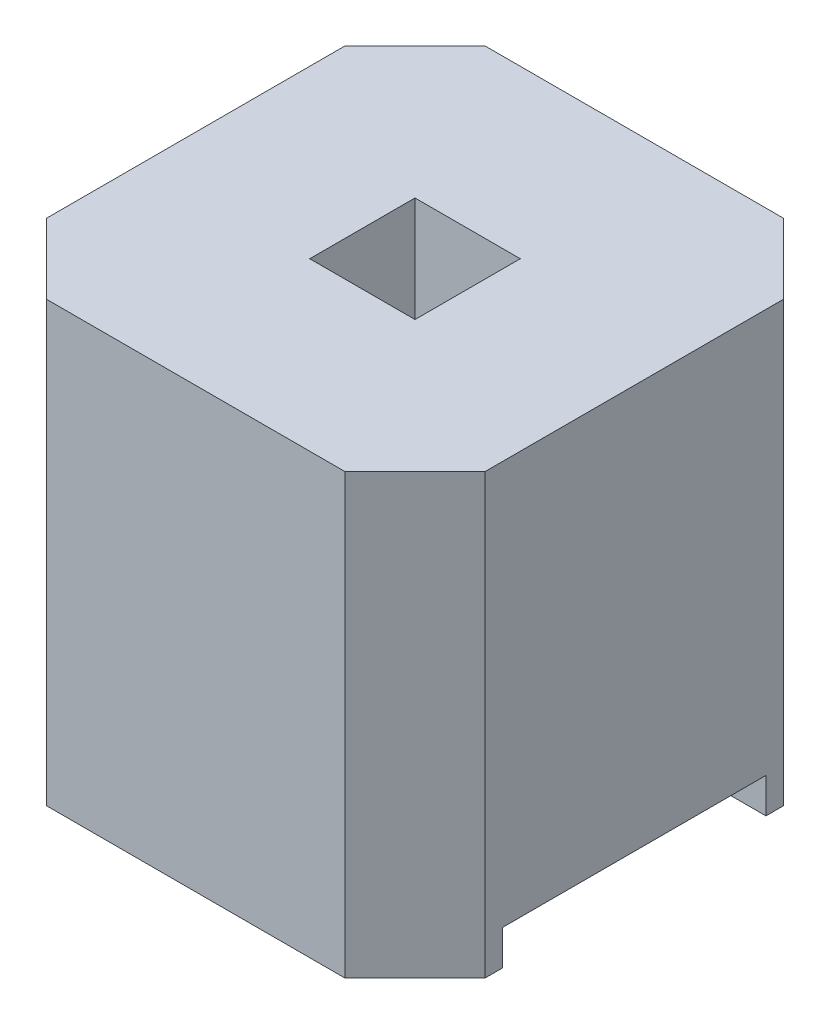
ISO-10303-21;
HEADER;
FILE_DESCRIPTION(('STEP AP214'),'2;1');
FILE_NAME('part.step','',(''),(''),'','','');
FILE_SCHEMA(('AUTOMOTIVE_DESIGN { 1 0 10303 214 1 1 1 1 }'));
ENDSEC;
DATA;
#1=APPLICATION_CONTEXT('core data for automotive mechanical design processes');
#2=APPLICATION_PROTOCOL_DEFINITION('international standard','automotive_design',2000,#1);
#3=PRODUCT_CONTEXT('',#1,'mechanical');
#4=PRODUCT('Part','Part','',(#3));
#5=PRODUCT_RELATED_PRODUCT_CATEGORY('part','',(#4));
#6=PRODUCT_DEFINITION_FORMATION('','',#4);
#7=PRODUCT_DEFINITION_CONTEXT('part definition',#1,'design');
#8=PRODUCT_DEFINITION('design','',#6,#7);
#9=PRODUCT_DEFINITION_SHAPE('','',#8);
#10=(LENGTH_UNIT() NAMED_UNIT(*) SI_UNIT(.MILLI.,.METRE.));
#11=(NAMED_UNIT(*) PLANE_ANGLE_UNIT() SI_UNIT($,.RADIAN.));
#12=(NAMED_UNIT(*) SI_UNIT($,.STERADIAN.) SOLID_ANGLE_UNIT());
#13=UNCERTAINTY_MEASURE_WITH_UNIT(LENGTH_MEASURE(1.E-05),#10,'distance_accuracy_value','');
#14=(GEOMETRIC_REPRESENTATION_CONTEXT(3) GLOBAL_UNCERTAINTY_ASSIGNED_CONTEXT((#13)) GLOBAL_UNIT_ASSIGNED_CONTEXT((#10,
#11,#12)) REPRESENTATION_CONTEXT('',''));
#15=CARTESIAN_POINT('',(0.,0.,0.));
#16=DIRECTION('',(0.,0.,1.));
#17=DIRECTION('',(1.,0.,0.));
#18=AXIS2_PLACEMENT_3D('',#15,#16,#17);
#19=CARTESIAN_POINT('',(0.,0.,0.));
#20=DIRECTION('',(0.,-1.,0.));
#21=DIRECTION('',(0.,0.,-1.));
#22=AXIS2_PLACEMENT_3D('',#19,#20,#21);
#23=PLANE('',#22);
#24=DIRECTION('',(-1.,0.,0.));
#25=VECTOR('',#24,1.);
#26=CARTESIAN_POINT('',(0.,0.,0.75));
#27=LINE('',#26,#25);
#28=CARTESIAN_POINT('',(1.25,0.,0.75));
#29=VERTEX_POINT('',#28);
#30=CARTESIAN_POINT('',(-1.25,0.,0.75));
#31=VERTEX_POINT('',#30);
#32=EDGE_CURVE('E284',#29,#31,#27,.T.);
#33=ORIENTED_EDGE('',*,*,#32,.F.);
#34=DIRECTION('',(0.,0.,-1.));
#35=VECTOR('',#34,1.);
#36=CARTESIAN_POINT('',(1.25,0.,0.850000000000001));
#37=LINE('',#36,#35);
#38=CARTESIAN_POINT('',(1.25,0.,0.850000000000001));
#39=VERTEX_POINT('',#38);
#40=EDGE_CURVE('E166',#39,#29,#37,.T.);
#41=ORIENTED_EDGE('',*,*,#40,.F.);
#42=DIRECTION('',(0.707106781186547,0.,-0.707106781186548));
#43=VECTOR('',#42,1.);
#44=CARTESIAN_POINT('',(0.850000000000001,0.,1.25));
#45=LINE('',#44,#43);
#46=CARTESIAN_POINT('',(0.850000000000001,0.,1.25));
#47=VERTEX_POINT('',#46);
#48=EDGE_CURVE('E177',#47,#39,#45,.T.);
#49=ORIENTED_EDGE('',*,*,#48,.F.);
#50=DIRECTION('',(1.,0.,0.));
#51=VECTOR('',#50,1.);
#52=CARTESIAN_POINT('',(-0.85,0.,1.25));
#53=LINE('',#52,#51);
#54=CARTESIAN_POINT('',(-0.85,0.,1.25));
#55=VERTEX_POINT('',#54);
#56=EDGE_CURVE('E258',#55,#47,#53,.T.);
#57=ORIENTED_EDGE('',*,*,#56,.F.);
#58=DIRECTION('',(0.707106781186547,0.,0.707106781186547));
#59=VECTOR('',#58,1.);
#60=CARTESIAN_POINT('',(-1.25,0.,0.850000000000001));
#61=LINE('',#60,#59);
#62=CARTESIAN_POINT('',(-1.25,0.,0.850000000000001));
#63=VERTEX_POINT('',#62);
#64=EDGE_CURVE('E257',#63,#55,#61,.T.);
#65=ORIENTED_EDGE('',*,*,#64,.F.);
#66=DIRECTION('',(0.,0.,1.));
#67=VECTOR('',#66,1.);
#68=CARTESIAN_POINT('',(-1.25,0.,0.850000000000001));
#69=LINE('',#68,#67);
#70=EDGE_CURVE('E238',#31,#63,#69,.T.);
#71=ORIENTED_EDGE('',*,*,#70,.F.);
#72=EDGE_LOOP('',(#33,#41,#49,#57,#65,#71));
#73=FACE_BOUND('',#72,.T.);
#74=ADVANCED_FACE('F33',(#73),#23,.T.);
#75=CARTESIAN_POINT('',(0.,2.5,0.));
#76=DIRECTION('',(0.,-1.,0.));
#77=DIRECTION('',(0.,0.,-1.));
#78=AXIS2_PLACEMENT_3D('',#75,#76,#77);
#79=PLANE('',#78);
#80=DIRECTION('',(0.,0.,1.));
#81=VECTOR('',#80,1.);
#82=CARTESIAN_POINT('',(-1.25,2.5,0.850000000000001));
#83=LINE('',#82,#81);
#84=CARTESIAN_POINT('',(-1.25,2.5,-0.849999999999999));
#85=VERTEX_POINT('',#84);
#86=CARTESIAN_POINT('',(-1.25,2.5,0.850000000000001));
#87=VERTEX_POINT('',#86);
#88=EDGE_CURVE('E184',#85,#87,#83,.T.);
#89=ORIENTED_EDGE('',*,*,#88,.T.);
#90=DIRECTION('',(0.707106781186547,0.,0.707106781186547));
#91=VECTOR('',#90,1.);
#92=CARTESIAN_POINT('',(-1.25,2.5,0.850000000000001));
#93=LINE('',#92,#91);
#94=CARTESIAN_POINT('',(-0.85,2.5,1.25));
#95=VERTEX_POINT('',#94);
#96=EDGE_CURVE('E241',#87,#95,#93,.T.);
#97=ORIENTED_EDGE('',*,*,#96,.T.);
#98=DIRECTION('',(1.,0.,0.));
#99=VECTOR('',#98,1.);
#100=CARTESIAN_POINT('',(-0.85,2.5,1.25));
#101=LINE('',#100,#99);
#102=CARTESIAN_POINT('',(0.850000000000001,2.5,1.25));
#103=VERTEX_POINT('',#102);
#104=EDGE_CURVE('E243',#95,#103,#101,.T.);
#105=ORIENTED_EDGE('',*,*,#104,.T.);
#106=DIRECTION('',(0.707106781186547,0.,-0.707106781186548));
#107=VECTOR('',#106,1.);
#108=CARTESIAN_POINT('',(0.850000000000001,2.5,1.25));
#109=LINE('',#108,#107);
#110=CARTESIAN_POINT('',(1.25,2.5,0.850000000000001));
#111=VERTEX_POINT('',#110);
#112=EDGE_CURVE('E245',#103,#111,#109,.T.);
#113=ORIENTED_EDGE('',*,*,#112,.T.);
#114=DIRECTION('',(0.,0.,-1.));
#115=VECTOR('',#114,1.);
#116=CARTESIAN_POINT('',(1.25,2.5,0.850000000000001));
#117=LINE('',#116,#115);
#118=CARTESIAN_POINT('',(1.25,2.5,-0.849999999999999));
#119=VERTEX_POINT('',#118);
#120=EDGE_CURVE('E247',#111,#119,#117,.T.);
#121=ORIENTED_EDGE('',*,*,#120,.T.);
#122=DIRECTION('',(-0.707106781186547,0.,-0.707106781186547));
#123=VECTOR('',#122,1.);
#124=CARTESIAN_POINT('',(0.85,2.5,-1.25));
#125=LINE('',#124,#123);
#126=CARTESIAN_POINT('',(0.85,2.5,-1.25));
#127=VERTEX_POINT('',#126);
#128=EDGE_CURVE('E249',#119,#127,#125,.T.);
#129=ORIENTED_EDGE('',*,*,#128,.T.);
#130=DIRECTION('',(-1.,0.,0.));
#131=VECTOR('',#130,1.);
#132=CARTESIAN_POINT('',(-0.85,2.5,-1.25));
#133=LINE('',#132,#131);
#134=CARTESIAN_POINT('',(-0.85,2.5,-1.25));
#135=VERTEX_POINT('',#134);
#136=EDGE_CURVE('E251',#127,#135,#133,.T.);
#137=ORIENTED_EDGE('',*,*,#136,.T.);
#138=DIRECTION('',(-0.707106781186547,0.,0.707106781186547));
#139=VECTOR('',#138,1.);
#140=CARTESIAN_POINT('',(-1.25,2.5,-0.849999999999999));
#141=LINE('',#140,#139);
#142=EDGE_CURVE('E189',#135,#85,#141,.T.);
#143=ORIENTED_EDGE('',*,*,#142,.T.);
#144=EDGE_LOOP('',(#89,#97,#105,#113,#121,#129,#137,#143));
#145=FACE_BOUND('',#144,.T.);
#146=DIRECTION('',(0.,0.,1.));
#147=VECTOR('',#146,1.);
#148=CARTESIAN_POINT('',(-0.3,2.5,-0.299999999999999));
#149=LINE('',#148,#147);
#150=CARTESIAN_POINT('',(-0.3,2.5,-0.299999999999999));
#151=VERTEX_POINT('',#150);
#152=CARTESIAN_POINT('',(-0.3,2.5,0.3));
#153=VERTEX_POINT('',#152);
#154=EDGE_CURVE('E286',#151,#153,#149,.T.);
#155=ORIENTED_EDGE('',*,*,#154,.F.);
#156=DIRECTION('',(-1.,0.,0.));
#157=VECTOR('',#156,1.);
#158=CARTESIAN_POINT('',(0.3,2.5,-0.3));
#159=LINE('',#158,#157);
#160=CARTESIAN_POINT('',(0.3,2.5,-0.3));
#161=VERTEX_POINT('',#160);
#162=EDGE_CURVE('E226',#161,#151,#159,.T.);
#163=ORIENTED_EDGE('',*,*,#162,.F.);
#164=DIRECTION('',(0.,0.,-1.));
#165=VECTOR('',#164,1.);
#166=CARTESIAN_POINT('',(0.3,2.5,-0.3));
#167=LINE('',#166,#165);
#168=CARTESIAN_POINT('',(0.3,2.5,0.3));
#169=VERTEX_POINT('',#168);
#170=EDGE_CURVE('E231',#169,#161,#167,.T.);
#171=ORIENTED_EDGE('',*,*,#170,.F.);
#172=DIRECTION('',(1.,0.,0.));
#173=VECTOR('',#172,1.);
#174=CARTESIAN_POINT('',(0.3,2.5,0.3));
#175=LINE('',#174,#173);
#176=EDGE_CURVE('E288',#153,#169,#175,.T.);
#177=ORIENTED_EDGE('',*,*,#176,.F.);
#178=EDGE_LOOP('',(#155,#163,#171,#177));
#179=FACE_BOUND('',#178,.T.);
#180=ADVANCED_FACE('F296',(#145,#179),#79,.F.);
#181=DIRECTION('',(1.,0.,0.));
#182=VECTOR('',#181,1.);
#183=CARTESIAN_POINT('',(0.,0.,-0.75));
#184=LINE('',#183,#182);
#185=CARTESIAN_POINT('',(-1.25,0.,-0.75));
#186=VERTEX_POINT('',#185);
#187=CARTESIAN_POINT('',(1.25,0.,-0.75));
#188=VERTEX_POINT('',#187);
#189=EDGE_CURVE('E221',#186,#188,#184,.T.);
#190=ORIENTED_EDGE('',*,*,#189,.F.);
#191=CARTESIAN_POINT('',(-1.25,0.,-0.849999999999999));
#192=VERTEX_POINT('',#191);
#193=EDGE_CURVE('E254',#192,#186,#69,.T.);
#194=ORIENTED_EDGE('',*,*,#193,.F.);
#195=DIRECTION('',(-0.707106781186547,0.,0.707106781186547));
#196=VECTOR('',#195,1.);
#197=CARTESIAN_POINT('',(-1.25,0.,-0.849999999999999));
#198=LINE('',#197,#196);
#199=CARTESIAN_POINT('',(-0.85,0.,-1.25));
#200=VERTEX_POINT('',#199);
#201=EDGE_CURVE('E182',#200,#192,#198,.T.);
#202=ORIENTED_EDGE('',*,*,#201,.F.);
#203=DIRECTION('',(-1.,0.,0.));
#204=VECTOR('',#203,1.);
#205=CARTESIAN_POINT('',(-0.85,0.,-1.25));
#206=LINE('',#205,#204);
#207=CARTESIAN_POINT('',(0.85,0.,-1.25));
#208=VERTEX_POINT('',#207);
#209=EDGE_CURVE('E175',#208,#200,#206,.T.);
#210=ORIENTED_EDGE('',*,*,#209,.F.);
#211=DIRECTION('',(-0.707106781186547,0.,-0.707106781186547));
#212=VECTOR('',#211,1.);
#213=CARTESIAN_POINT('',(0.85,0.,-1.25));
#214=LINE('',#213,#212);
#215=CARTESIAN_POINT('',(1.25,0.,-0.849999999999999));
#216=VERTEX_POINT('',#215);
#217=EDGE_CURVE('E172',#216,#208,#214,.T.);
#218=ORIENTED_EDGE('',*,*,#217,.F.);
#219=EDGE_CURVE('E173',#188,#216,#37,.T.);
#220=ORIENTED_EDGE('',*,*,#219,.F.);
#221=EDGE_LOOP('',(#190,#194,#202,#210,#218,#220));
#222=FACE_BOUND('',#221,.T.);
#223=ADVANCED_FACE('F310',(#222),#23,.T.);
#224=CARTESIAN_POINT('',(-1.25,2.5,0.850000000000001));
#225=DIRECTION('',(1.,0.,0.));
#226=DIRECTION('',(0.,0.,-1.));
#227=AXIS2_PLACEMENT_3D('',#224,#225,#226);
#228=PLANE('',#227);
#229=DIRECTION('',(0.,0.,-1.));
#230=VECTOR('',#229,1.);
#231=CARTESIAN_POINT('',(-1.25,0.2,-0.75));
#232=LINE('',#231,#230);
#233=CARTESIAN_POINT('',(-1.25,0.2,0.75));
#234=VERTEX_POINT('',#233);
#235=CARTESIAN_POINT('',(-1.25,0.2,-0.75));
#236=VERTEX_POINT('',#235);
#237=EDGE_CURVE('E274',#234,#236,#232,.T.);
#238=ORIENTED_EDGE('',*,*,#237,.F.);
#239=DIRECTION('',(0.,1.,0.));
#240=VECTOR('',#239,1.);
#241=CARTESIAN_POINT('',(-1.25,-0.2,0.75));
#242=LINE('',#241,#240);
#243=EDGE_CURVE('E150',#31,#234,#242,.T.);
#244=ORIENTED_EDGE('',*,*,#243,.F.);
#245=ORIENTED_EDGE('',*,*,#70,.T.);
#246=DIRECTION('',(0.,-1.,0.));
#247=VECTOR('',#246,1.);
#248=CARTESIAN_POINT('',(-1.25,2.5,0.850000000000001));
#249=LINE('',#248,#247);
#250=EDGE_CURVE('E205',#87,#63,#249,.T.);
#251=ORIENTED_EDGE('',*,*,#250,.F.);
#252=ORIENTED_EDGE('',*,*,#88,.F.);
#253=DIRECTION('',(0.,-1.,0.));
#254=VECTOR('',#253,1.);
#255=CARTESIAN_POINT('',(-1.25,2.5,-0.849999999999999));
#256=LINE('',#255,#254);
#257=EDGE_CURVE('E185',#85,#192,#256,.T.);
#258=ORIENTED_EDGE('',*,*,#257,.T.);
#259=ORIENTED_EDGE('',*,*,#193,.T.);
#260=DIRECTION('',(0.,-1.,0.));
#261=VECTOR('',#260,1.);
#262=CARTESIAN_POINT('',(-1.25,-0.2,-0.75));
#263=LINE('',#262,#261);
#264=EDGE_CURVE('E160',#236,#186,#263,.T.);
#265=ORIENTED_EDGE('',*,*,#264,.F.);
#266=EDGE_LOOP('',(#238,#244,#245,#251,#252,#258,#259,#265));
#267=FACE_BOUND('',#266,.T.);
#268=ADVANCED_FACE('F35',(#267),#228,.F.);
#269=CARTESIAN_POINT('',(-1.25,2.5,0.850000000000001));
#270=DIRECTION('',(0.707106781186548,0.,-0.707106781186548));
#271=DIRECTION('',(-0.707106781186548,0.,-0.707106781186548));
#272=AXIS2_PLACEMENT_3D('',#269,#270,#271);
#273=PLANE('',#272);
#274=ORIENTED_EDGE('',*,*,#64,.T.);
#275=DIRECTION('',(0.,-1.,0.));
#276=VECTOR('',#275,1.);
#277=CARTESIAN_POINT('',(-0.85,2.5,1.25));
#278=LINE('',#277,#276);
#279=EDGE_CURVE('E202',#95,#55,#278,.T.);
#280=ORIENTED_EDGE('',*,*,#279,.F.);
#281=ORIENTED_EDGE('',*,*,#96,.F.);
#282=ORIENTED_EDGE('',*,*,#250,.T.);
#283=EDGE_LOOP('',(#274,#280,#281,#282));
#284=FACE_BOUND('',#283,.T.);
#285=ADVANCED_FACE('F270',(#284),#273,.F.);
#286=CARTESIAN_POINT('',(-0.85,2.5,1.25));
#287=DIRECTION('',(0.,0.,-1.));
#288=DIRECTION('',(-1.,0.,0.));
#289=AXIS2_PLACEMENT_3D('',#286,#287,#288);
#290=PLANE('',#289);
#291=ORIENTED_EDGE('',*,*,#56,.T.);
#292=DIRECTION('',(0.,-1.,0.));
#293=VECTOR('',#292,1.);
#294=CARTESIAN_POINT('',(0.850000000000001,2.5,1.25));
#295=LINE('',#294,#293);
#296=EDGE_CURVE('E199',#103,#47,#295,.T.);
#297=ORIENTED_EDGE('',*,*,#296,.F.);
#298=ORIENTED_EDGE('',*,*,#104,.F.);
#299=ORIENTED_EDGE('',*,*,#279,.T.);
#300=EDGE_LOOP('',(#291,#297,#298,#299));
#301=FACE_BOUND('',#300,.T.);
#302=ADVANCED_FACE('F341',(#301),#290,.F.);
#303=CARTESIAN_POINT('',(0.850000000000001,2.5,1.25));
#304=DIRECTION('',(-0.707106781186548,0.,-0.707106781186547));
#305=DIRECTION('',(-0.707106781186547,0.,0.707106781186548));
#306=AXIS2_PLACEMENT_3D('',#303,#304,#305);
#307=PLANE('',#306);
#308=ORIENTED_EDGE('',*,*,#48,.T.);
#309=DIRECTION('',(0.,-1.,0.));
#310=VECTOR('',#309,1.);
#311=CARTESIAN_POINT('',(1.25,2.5,0.850000000000001));
#312=LINE('',#311,#310);
#313=EDGE_CURVE('E169',#111,#39,#312,.T.);
#314=ORIENTED_EDGE('',*,*,#313,.F.);
#315=ORIENTED_EDGE('',*,*,#112,.F.);
#316=ORIENTED_EDGE('',*,*,#296,.T.);
#317=EDGE_LOOP('',(#308,#314,#315,#316));
#318=FACE_BOUND('',#317,.T.);
#319=ADVANCED_FACE('F263',(#318),#307,.F.);
#320=CARTESIAN_POINT('',(1.25,2.5,0.850000000000001));
#321=DIRECTION('',(-1.,0.,0.));
#322=DIRECTION('',(0.,0.,1.));
#323=AXIS2_PLACEMENT_3D('',#320,#321,#322);
#324=PLANE('',#323);
#325=ORIENTED_EDGE('',*,*,#40,.T.);
#326=DIRECTION('',(0.,1.,0.));
#327=VECTOR('',#326,1.);
#328=CARTESIAN_POINT('',(1.25,2.5,0.75));
#329=LINE('',#328,#327);
#330=CARTESIAN_POINT('',(1.25,0.2,0.75));
#331=VERTEX_POINT('',#330);
#332=EDGE_CURVE('E11',#29,#331,#329,.T.);
#333=ORIENTED_EDGE('',*,*,#332,.T.);
#334=DIRECTION('',(0.,0.,-1.));
#335=VECTOR('',#334,1.);
#336=CARTESIAN_POINT('',(1.25,0.2,-0.75));
#337=LINE('',#336,#335);
#338=CARTESIAN_POINT('',(1.25,0.2,-0.75));
#339=VERTEX_POINT('',#338);
#340=EDGE_CURVE('E157',#331,#339,#337,.T.);
#341=ORIENTED_EDGE('',*,*,#340,.T.);
#342=DIRECTION('',(0.,-1.,0.));
#343=VECTOR('',#342,1.);
#344=CARTESIAN_POINT('',(1.25,-0.2,-0.75));
#345=LINE('',#344,#343);
#346=EDGE_CURVE('E48',#339,#188,#345,.T.);
#347=ORIENTED_EDGE('',*,*,#346,.T.);
#348=ORIENTED_EDGE('',*,*,#219,.T.);
#349=DIRECTION('',(0.,-1.,0.));
#350=VECTOR('',#349,1.);
#351=CARTESIAN_POINT('',(1.25,2.5,-0.849999999999999));
#352=LINE('',#351,#350);
#353=EDGE_CURVE('E195',#119,#216,#352,.T.);
#354=ORIENTED_EDGE('',*,*,#353,.F.);
#355=ORIENTED_EDGE('',*,*,#120,.F.);
#356=ORIENTED_EDGE('',*,*,#313,.T.);
#357=EDGE_LOOP('',(#325,#333,#341,#347,#348,#354,#355,#356));
#358=FACE_BOUND('',#357,.T.);
#359=ADVANCED_FACE('F163',(#358),#324,.F.);
#360=CARTESIAN_POINT('',(0.85,2.5,-1.25));
#361=DIRECTION('',(-0.707106781186548,0.,0.707106781186548));
#362=DIRECTION('',(0.707106781186548,0.,0.707106781186548));
#363=AXIS2_PLACEMENT_3D('',#360,#361,#362);
#364=PLANE('',#363);
#365=ORIENTED_EDGE('',*,*,#217,.T.);
#366=DIRECTION('',(0.,-1.,0.));
#367=VECTOR('',#366,1.);
#368=CARTESIAN_POINT('',(0.85,2.5,-1.25));
#369=LINE('',#368,#367);
#370=EDGE_CURVE('E192',#127,#208,#369,.T.);
#371=ORIENTED_EDGE('',*,*,#370,.F.);
#372=ORIENTED_EDGE('',*,*,#128,.F.);
#373=ORIENTED_EDGE('',*,*,#353,.T.);
#374=EDGE_LOOP('',(#365,#371,#372,#373));
#375=FACE_BOUND('',#374,.T.);
#376=ADVANCED_FACE('F338',(#375),#364,.F.);
#377=CARTESIAN_POINT('',(-0.85,2.5,-1.25));
#378=DIRECTION('',(0.,0.,1.));
#379=DIRECTION('',(1.,0.,0.));
#380=AXIS2_PLACEMENT_3D('',#377,#378,#379);
#381=PLANE('',#380);
#382=ORIENTED_EDGE('',*,*,#209,.T.);
#383=DIRECTION('',(0.,-1.,0.));
#384=VECTOR('',#383,1.);
#385=CARTESIAN_POINT('',(-0.85,2.5,-1.25));
#386=LINE('',#385,#384);
#387=EDGE_CURVE('E188',#135,#200,#386,.T.);
#388=ORIENTED_EDGE('',*,*,#387,.F.);
#389=ORIENTED_EDGE('',*,*,#136,.F.);
#390=ORIENTED_EDGE('',*,*,#370,.T.);
#391=EDGE_LOOP('',(#382,#388,#389,#390));
#392=FACE_BOUND('',#391,.T.);
#393=ADVANCED_FACE('F333',(#392),#381,.F.);
#394=CARTESIAN_POINT('',(-1.25,2.5,-0.849999999999999));
#395=DIRECTION('',(0.707106781186548,0.,0.707106781186548));
#396=DIRECTION('',(0.707106781186548,0.,-0.707106781186548));
#397=AXIS2_PLACEMENT_3D('',#394,#395,#396);
#398=PLANE('',#397);
#399=ORIENTED_EDGE('',*,*,#201,.T.);
#400=ORIENTED_EDGE('',*,*,#257,.F.);
#401=ORIENTED_EDGE('',*,*,#142,.F.);
#402=ORIENTED_EDGE('',*,*,#387,.T.);
#403=EDGE_LOOP('',(#399,#400,#401,#402));
#404=FACE_BOUND('',#403,.T.);
#405=ADVANCED_FACE('F306',(#404),#398,.F.);
#406=CARTESIAN_POINT('',(-0.3,2.5,-0.299999999999999));
#407=DIRECTION('',(1.,0.,0.));
#408=DIRECTION('',(0.,0.,-1.));
#409=AXIS2_PLACEMENT_3D('',#406,#407,#408);
#410=PLANE('',#409);
#411=DIRECTION('',(0.,0.,1.));
#412=VECTOR('',#411,1.);
#413=CARTESIAN_POINT('',(-0.3,0.2,-0.299999999999999));
#414=LINE('',#413,#412);
#415=CARTESIAN_POINT('',(-0.3,0.2,-0.299999999999999));
#416=VERTEX_POINT('',#415);
#417=CARTESIAN_POINT('',(-0.3,0.2,0.3));
#418=VERTEX_POINT('',#417);
#419=EDGE_CURVE('E208',#416,#418,#414,.T.);
#420=ORIENTED_EDGE('',*,*,#419,.F.);
#421=DIRECTION('',(0.,-1.,0.));
#422=VECTOR('',#421,1.);
#423=CARTESIAN_POINT('',(-0.3,2.5,-0.299999999999999));
#424=LINE('',#423,#422);
#425=EDGE_CURVE('E217',#151,#416,#424,.T.);
#426=ORIENTED_EDGE('',*,*,#425,.F.);
#427=ORIENTED_EDGE('',*,*,#154,.T.);
#428=DIRECTION('',(0.,-1.,0.));
#429=VECTOR('',#428,1.);
#430=CARTESIAN_POINT('',(-0.3,2.5,0.3));
#431=LINE('',#430,#429);
#432=EDGE_CURVE('E220',#153,#418,#431,.T.);
#433=ORIENTED_EDGE('',*,*,#432,.T.);
#434=EDGE_LOOP('',(#420,#426,#427,#433));
#435=FACE_BOUND('',#434,.T.);
#436=ADVANCED_FACE('F216',(#435),#410,.T.);
#437=CARTESIAN_POINT('',(0.3,2.5,0.3));
#438=DIRECTION('',(0.,0.,-1.));
#439=DIRECTION('',(-1.,0.,0.));
#440=AXIS2_PLACEMENT_3D('',#437,#438,#439);
#441=PLANE('',#440);
#442=DIRECTION('',(1.,0.,0.));
#443=VECTOR('',#442,1.);
#444=CARTESIAN_POINT('',(0.3,0.2,0.3));
#445=LINE('',#444,#443);
#446=CARTESIAN_POINT('',(0.3,0.2,0.3));
#447=VERTEX_POINT('',#446);
#448=EDGE_CURVE('E222',#418,#447,#445,.T.);
#449=ORIENTED_EDGE('',*,*,#448,.F.);
#450=ORIENTED_EDGE('',*,*,#432,.F.);
#451=ORIENTED_EDGE('',*,*,#176,.T.);
#452=DIRECTION('',(0.,-1.,0.));
#453=VECTOR('',#452,1.);
#454=CARTESIAN_POINT('',(0.3,2.5,0.3));
#455=LINE('',#454,#453);
#456=EDGE_CURVE('E229',#169,#447,#455,.T.);
#457=ORIENTED_EDGE('',*,*,#456,.T.);
#458=EDGE_LOOP('',(#449,#450,#451,#457));
#459=FACE_BOUND('',#458,.T.);
#460=ADVANCED_FACE('F298',(#459),#441,.T.);
#461=CARTESIAN_POINT('',(0.3,2.5,-0.3));
#462=DIRECTION('',(-1.,0.,0.));
#463=DIRECTION('',(0.,0.,1.));
#464=AXIS2_PLACEMENT_3D('',#461,#462,#463);
#465=PLANE('',#464);
#466=DIRECTION('',(0.,0.,-1.));
#467=VECTOR('',#466,1.);
#468=CARTESIAN_POINT('',(0.3,0.2,-0.3));
#469=LINE('',#468,#467);
#470=CARTESIAN_POINT('',(0.3,0.2,-0.3));
#471=VERTEX_POINT('',#470);
#472=EDGE_CURVE('E56',#447,#471,#469,.T.);
#473=ORIENTED_EDGE('',*,*,#472,.F.);
#474=ORIENTED_EDGE('',*,*,#456,.F.);
#475=ORIENTED_EDGE('',*,*,#170,.T.);
#476=DIRECTION('',(0.,-1.,0.));
#477=VECTOR('',#476,1.);
#478=CARTESIAN_POINT('',(0.3,2.5,-0.3));
#479=LINE('',#478,#477);
#480=EDGE_CURVE('E227',#161,#471,#479,.T.);
#481=ORIENTED_EDGE('',*,*,#480,.T.);
#482=EDGE_LOOP('',(#473,#474,#475,#481));
#483=FACE_BOUND('',#482,.T.);
#484=ADVANCED_FACE('F293',(#483),#465,.T.);
#485=CARTESIAN_POINT('',(0.3,2.5,-0.3));
#486=DIRECTION('',(0.,0.,1.));
#487=DIRECTION('',(1.,0.,0.));
#488=AXIS2_PLACEMENT_3D('',#485,#486,#487);
#489=PLANE('',#488);
#490=DIRECTION('',(-1.,0.,0.));
#491=VECTOR('',#490,1.);
#492=CARTESIAN_POINT('',(0.3,0.2,-0.3));
#493=LINE('',#492,#491);
#494=EDGE_CURVE('E41',#471,#416,#493,.T.);
#495=ORIENTED_EDGE('',*,*,#494,.F.);
#496=ORIENTED_EDGE('',*,*,#480,.F.);
#497=ORIENTED_EDGE('',*,*,#162,.T.);
#498=ORIENTED_EDGE('',*,*,#425,.T.);
#499=EDGE_LOOP('',(#495,#496,#497,#498));
#500=FACE_BOUND('',#499,.T.);
#501=ADVANCED_FACE('F224',(#500),#489,.T.);
#502=CARTESIAN_POINT('',(1.25,-0.2,0.75));
#503=DIRECTION('',(0.,0.,1.));
#504=DIRECTION('',(1.,0.,0.));
#505=AXIS2_PLACEMENT_3D('',#502,#503,#504);
#506=PLANE('',#505);
#507=ORIENTED_EDGE('',*,*,#32,.T.);
#508=ORIENTED_EDGE('',*,*,#243,.T.);
#509=DIRECTION('',(-1.,0.,0.));
#510=VECTOR('',#509,1.);
#511=CARTESIAN_POINT('',(1.25,0.2,0.75));
#512=LINE('',#511,#510);
#513=EDGE_CURVE('E145',#331,#234,#512,.T.);
#514=ORIENTED_EDGE('',*,*,#513,.F.);
#515=ORIENTED_EDGE('',*,*,#332,.F.);
#516=EDGE_LOOP('',(#507,#508,#514,#515));
#517=FACE_BOUND('',#516,.T.);
#518=ADVANCED_FACE('F147',(#517),#506,.F.);
#519=CARTESIAN_POINT('',(1.25,-0.2,-0.75));
#520=DIRECTION('',(0.,0.,-1.));
#521=DIRECTION('',(-1.,0.,0.));
#522=AXIS2_PLACEMENT_3D('',#519,#520,#521);
#523=PLANE('',#522);
#524=ORIENTED_EDGE('',*,*,#189,.T.);
#525=ORIENTED_EDGE('',*,*,#346,.F.);
#526=DIRECTION('',(-1.,0.,0.));
#527=VECTOR('',#526,1.);
#528=CARTESIAN_POINT('',(1.25,0.2,-0.75));
#529=LINE('',#528,#527);
#530=EDGE_CURVE('E154',#339,#236,#529,.T.);
#531=ORIENTED_EDGE('',*,*,#530,.T.);
#532=ORIENTED_EDGE('',*,*,#264,.T.);
#533=EDGE_LOOP('',(#524,#525,#531,#532));
#534=FACE_BOUND('',#533,.T.);
#535=ADVANCED_FACE('F396',(#534),#523,.F.);
#536=CARTESIAN_POINT('',(1.25,0.2,-0.75));
#537=DIRECTION('',(0.,1.,0.));
#538=DIRECTION('',(0.,0.,1.));
#539=AXIS2_PLACEMENT_3D('',#536,#537,#538);
#540=PLANE('',#539);
#541=ORIENTED_EDGE('',*,*,#419,.T.);
#542=ORIENTED_EDGE('',*,*,#448,.T.);
#543=ORIENTED_EDGE('',*,*,#472,.T.);
#544=ORIENTED_EDGE('',*,*,#494,.T.);
#545=EDGE_LOOP('',(#541,#542,#543,#544));
#546=FACE_BOUND('',#545,.T.);
#547=ORIENTED_EDGE('',*,*,#237,.T.);
#548=ORIENTED_EDGE('',*,*,#530,.F.);
#549=ORIENTED_EDGE('',*,*,#340,.F.);
#550=ORIENTED_EDGE('',*,*,#513,.T.);
#551=EDGE_LOOP('',(#547,#548,#549,#550));
#552=FACE_BOUND('',#551,.T.);
#553=ADVANCED_FACE('F158',(#546,#552),#540,.F.);
#554=CLOSED_SHELL('',(#74,#180,#223,#268,#285,#302,#319,#359,#376,#393,#405,#436,#460,#484,#501,
#518,#535,#553));
#555=MANIFOLD_SOLID_BREP('B2',#554);
#556=ADVANCED_BREP_SHAPE_REPRESENTATION('',(#18,#555),#14);
#557=SHAPE_DEFINITION_REPRESENTATION(#9,#556);
ENDSEC;
END-ISO-10303-21;
